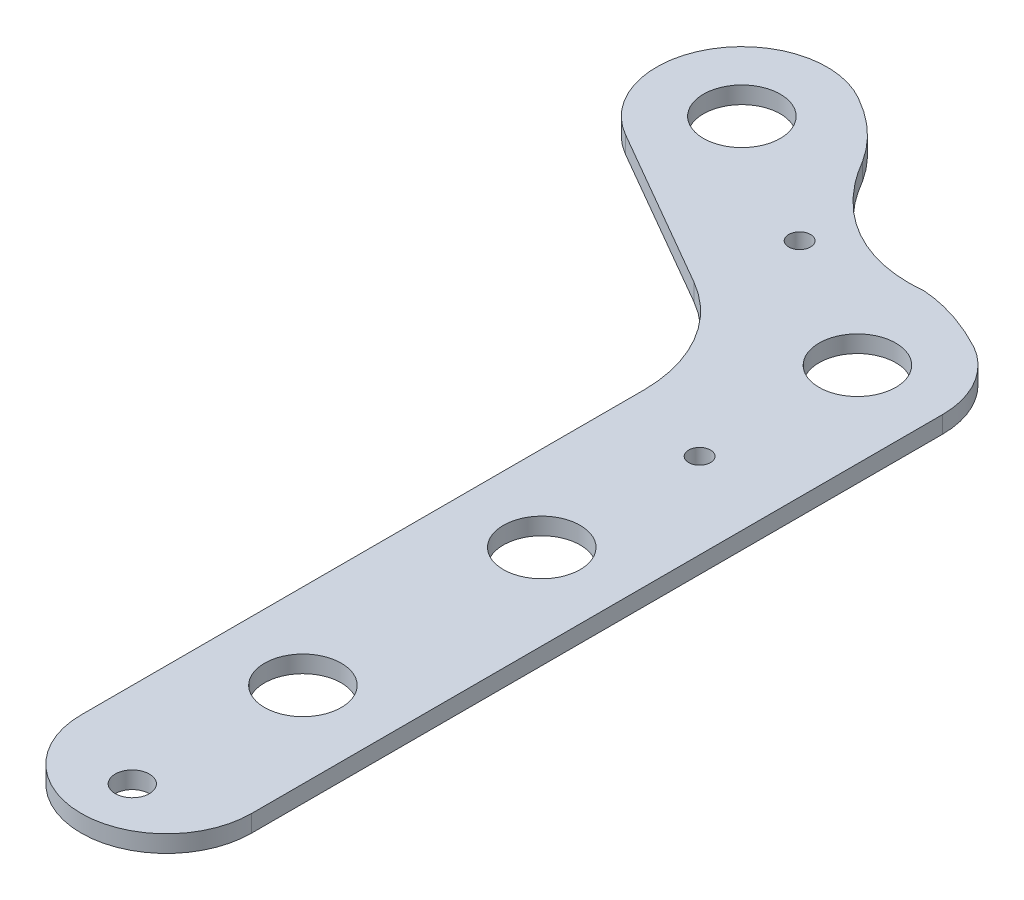
ISO-10303-21;
HEADER;
FILE_DESCRIPTION(('STEP AP214'),'2;1');
FILE_NAME('part.step','',(''),(''),'','','');
FILE_SCHEMA(('AUTOMOTIVE_DESIGN { 1 0 10303 214 1 1 1 1 }'));
ENDSEC;
DATA;
#1=APPLICATION_CONTEXT('core data for automotive mechanical design processes');
#2=APPLICATION_PROTOCOL_DEFINITION('international standard','automotive_design',2000,#1);
#3=PRODUCT_CONTEXT('',#1,'mechanical');
#4=PRODUCT('Part','Part','',(#3));
#5=PRODUCT_RELATED_PRODUCT_CATEGORY('part','',(#4));
#6=PRODUCT_DEFINITION_FORMATION('','',#4);
#7=PRODUCT_DEFINITION_CONTEXT('part definition',#1,'design');
#8=PRODUCT_DEFINITION('design','',#6,#7);
#9=PRODUCT_DEFINITION_SHAPE('','',#8);
#10=(LENGTH_UNIT() NAMED_UNIT(*) SI_UNIT(.MILLI.,.METRE.));
#11=(NAMED_UNIT(*) PLANE_ANGLE_UNIT() SI_UNIT($,.RADIAN.));
#12=(NAMED_UNIT(*) SI_UNIT($,.STERADIAN.) SOLID_ANGLE_UNIT());
#13=UNCERTAINTY_MEASURE_WITH_UNIT(LENGTH_MEASURE(1.E-05),#10,'distance_accuracy_value','');
#14=(GEOMETRIC_REPRESENTATION_CONTEXT(3) GLOBAL_UNCERTAINTY_ASSIGNED_CONTEXT((#13)) GLOBAL_UNIT_ASSIGNED_CONTEXT((#10,
#11,#12)) REPRESENTATION_CONTEXT('',''));
#15=CARTESIAN_POINT('',(0.,0.,0.));
#16=DIRECTION('',(0.,0.,1.));
#17=DIRECTION('',(1.,0.,0.));
#18=AXIS2_PLACEMENT_3D('',#15,#16,#17);
#19=CARTESIAN_POINT('',(-101.736334309577,6.35,-176.2125));
#20=DIRECTION('',(0.,-1.,0.));
#21=DIRECTION('',(0.,0.,-1.));
#22=AXIS2_PLACEMENT_3D('',#19,#20,#21);
#23=PLANE('',#22);
#24=CARTESIAN_POINT('',(-101.736334309577,6.35,-176.2125));
#25=DIRECTION('',(0.,1.,0.));
#26=DIRECTION('',(0.,0.,-1.));
#27=AXIS2_PLACEMENT_3D('',#24,#25,#26);
#28=CIRCLE('',#27,31.7499999999993);
#29=CARTESIAN_POINT('',(-85.8613343095773,6.35,-203.708806570155));
#30=VERTEX_POINT('',#29);
#31=CARTESIAN_POINT('',(-117.611334309577,6.35,-148.716193429845));
#32=VERTEX_POINT('',#31);
#33=EDGE_CURVE('E275',#30,#32,#28,.T.);
#34=ORIENTED_EDGE('',*,*,#33,.T.);
#35=DIRECTION('',(0.866025403784439,0.,0.5));
#36=VECTOR('',#35,1.);
#37=CARTESIAN_POINT('',(-57.1500000000007,6.35,-113.808825790647));
#38=LINE('',#37,#36);
#39=CARTESIAN_POINT('',(-57.1500000000007,6.35,-113.808825790647));
#40=VERTEX_POINT('',#39);
#41=EDGE_CURVE('E102',#32,#40,#38,.T.);
#42=ORIENTED_EDGE('',*,*,#41,.T.);
#43=CARTESIAN_POINT('',(-82.5500000000007,6.35,-69.8147352783976));
#44=DIRECTION('',(0.,-1.,0.));
#45=DIRECTION('',(0.,0.,1.));
#46=AXIS2_PLACEMENT_3D('',#43,#44,#45);
#47=CIRCLE('',#46,50.8);
#48=CARTESIAN_POINT('',(-31.7500000000007,6.35,-69.8147352783976));
#49=VERTEX_POINT('',#48);
#50=EDGE_CURVE('E278',#40,#49,#47,.T.);
#51=ORIENTED_EDGE('',*,*,#50,.T.);
#52=DIRECTION('',(0.,0.,1.));
#53=VECTOR('',#52,1.);
#54=CARTESIAN_POINT('',(-31.7500000000007,6.35,18.2729184521306));
#55=LINE('',#54,#53);
#56=CARTESIAN_POINT('',(-31.7500000000007,6.35,139.7));
#57=VERTEX_POINT('',#56);
#58=EDGE_CURVE('E280',#49,#57,#55,.T.);
#59=ORIENTED_EDGE('',*,*,#58,.T.);
#60=CARTESIAN_POINT('',(-7.01545972458869E-13,6.35,139.7));
#61=DIRECTION('',(0.,1.,0.));
#62=DIRECTION('',(0.,0.,-1.));
#63=AXIS2_PLACEMENT_3D('',#60,#61,#62);
#64=CIRCLE('',#63,31.75);
#65=CARTESIAN_POINT('',(31.7499999999993,6.35,139.7));
#66=VERTEX_POINT('',#65);
#67=EDGE_CURVE('E282',#57,#66,#64,.T.);
#68=ORIENTED_EDGE('',*,*,#67,.T.);
#69=DIRECTION('',(0.,0.,-1.));
#70=VECTOR('',#69,1.);
#71=CARTESIAN_POINT('',(31.7499999999993,6.35,78.3930280471627));
#72=LINE('',#71,#70);
#73=CARTESIAN_POINT('',(31.7499999999993,6.35,-117.475));
#74=VERTEX_POINT('',#73);
#75=EDGE_CURVE('E284',#66,#74,#72,.T.);
#76=ORIENTED_EDGE('',*,*,#75,.T.);
#77=CARTESIAN_POINT('',(0.,6.35,-117.475));
#78=DIRECTION('',(0.,1.,0.));
#79=DIRECTION('',(0.,0.,1.));
#80=AXIS2_PLACEMENT_3D('',#77,#78,#79);
#81=CIRCLE('',#80,31.7499999999993);
#82=CARTESIAN_POINT('',(15.8749999999996,6.35,-144.971306570155));
#83=VERTEX_POINT('',#82);
#84=EDGE_CURVE('E127',#74,#83,#81,.T.);
#85=ORIENTED_EDGE('',*,*,#84,.T.);
#86=CARTESIAN_POINT('',(15.8749999999997,6.35,-144.971306570155));
#87=CARTESIAN_POINT('',(1.22445048235463,6.35,-152.855976046516));
#88=CARTESIAN_POINT('',(-11.4263853245987,6.35,-153.835795689486));
#89=B_SPLINE_CURVE_WITH_KNOTS('',2,(#86,#87,#88),.UNSPECIFIED.,.F.,.F.,(3,3),(0.,1.),.UNSPECIFIED.);
#90=CARTESIAN_POINT('',(-11.4263853245987,6.35,-153.835795689486));
#91=VERTEX_POINT('',#90);
#92=EDGE_CURVE('E121',#83,#91,#89,.T.);
#93=ORIENTED_EDGE('',*,*,#92,.T.);
#94=CARTESIAN_POINT('',(-11.4263853245987,6.35,-153.835795689486));
#95=CARTESIAN_POINT('',(-33.1836717397411,6.35,-151.627706726659));
#96=CARTESIAN_POINT('',(-52.4235071210075,6.35,-162.771572898098));
#97=CARTESIAN_POINT('',(-64.7835066551173,6.35,-184.207168681212));
#98=B_SPLINE_CURVE_WITH_KNOTS('',3,(#94,#95,#96,#97),.UNSPECIFIED.,.F.,.F.,(4,4),(0.,1.),.UNSPECIFIED.);
#99=CARTESIAN_POINT('',(-64.7835066551173,6.35,-184.207168681212));
#100=VERTEX_POINT('',#99);
#101=EDGE_CURVE('E125',#91,#100,#98,.T.);
#102=ORIENTED_EDGE('',*,*,#101,.T.);
#103=CARTESIAN_POINT('',(-64.7835066551173,6.35,-184.207168681212));
#104=CARTESIAN_POINT('',(-72.3862869621943,6.35,-196.104383794497));
#105=CARTESIAN_POINT('',(-85.8613343095773,6.35,-203.708806570155));
#106=B_SPLINE_CURVE_WITH_KNOTS('',2,(#103,#104,#105),.UNSPECIFIED.,.F.,.F.,(3,3),(0.,1.),.UNSPECIFIED.);
#107=EDGE_CURVE('E53',#100,#30,#106,.T.);
#108=ORIENTED_EDGE('',*,*,#107,.T.);
#109=EDGE_LOOP('',(#34,#42,#51,#59,#68,#76,#85,#93,#102,#108));
#110=FACE_BOUND('',#109,.T.);
#111=CARTESIAN_POINT('',(0.,6.35,0.));
#112=DIRECTION('',(0.,1.,0.));
#113=DIRECTION('',(0.,0.,1.));
#114=AXIS2_PLACEMENT_3D('',#111,#112,#113);
#115=CIRCLE('',#114,14.2875);
#116=CARTESIAN_POINT('',(0.,6.35,14.2875));
#117=VERTEX_POINT('',#116);
#118=EDGE_CURVE('E269',#117,#117,#115,.T.);
#119=ORIENTED_EDGE('',*,*,#118,.F.);
#120=EDGE_LOOP('',(#119));
#121=FACE_BOUND('',#120,.T.);
#122=CARTESIAN_POINT('',(0.,6.35,88.9));
#123=DIRECTION('',(0.,1.,0.));
#124=DIRECTION('',(0.,0.,1.));
#125=AXIS2_PLACEMENT_3D('',#122,#123,#124);
#126=CIRCLE('',#125,14.2875);
#127=CARTESIAN_POINT('',(0.,6.35,103.1875));
#128=VERTEX_POINT('',#127);
#129=EDGE_CURVE('E263',#128,#128,#126,.T.);
#130=ORIENTED_EDGE('',*,*,#129,.F.);
#131=EDGE_LOOP('',(#130));
#132=FACE_BOUND('',#131,.T.);
#133=CARTESIAN_POINT('',(0.,6.35,-117.475));
#134=DIRECTION('',(0.,1.,0.));
#135=DIRECTION('',(0.,0.,1.));
#136=AXIS2_PLACEMENT_3D('',#133,#134,#135);
#137=CIRCLE('',#136,14.2875);
#138=CARTESIAN_POINT('',(0.,6.35,-103.1875));
#139=VERTEX_POINT('',#138);
#140=EDGE_CURVE('E257',#139,#139,#137,.T.);
#141=ORIENTED_EDGE('',*,*,#140,.F.);
#142=EDGE_LOOP('',(#141));
#143=FACE_BOUND('',#142,.T.);
#144=CARTESIAN_POINT('',(-101.736334309577,6.35,-176.2125));
#145=DIRECTION('',(0.,1.,0.));
#146=DIRECTION('',(0.,0.,1.));
#147=AXIS2_PLACEMENT_3D('',#144,#145,#146);
#148=CIRCLE('',#147,14.2874999999995);
#149=CARTESIAN_POINT('',(-101.736334309577,6.35,-161.925));
#150=VERTEX_POINT('',#149);
#151=EDGE_CURVE('E251',#150,#150,#148,.T.);
#152=ORIENTED_EDGE('',*,*,#151,.F.);
#153=EDGE_LOOP('',(#152));
#154=FACE_BOUND('',#153,.T.);
#155=CARTESIAN_POINT('',(-50.8681671547885,6.35,-146.84375));
#156=DIRECTION('',(0.,1.,0.));
#157=DIRECTION('',(0.,0.,1.));
#158=AXIS2_PLACEMENT_3D('',#155,#156,#157);
#159=CIRCLE('',#158,4.064);
#160=CARTESIAN_POINT('',(-50.8681671547885,6.35,-142.77975));
#161=VERTEX_POINT('',#160);
#162=EDGE_CURVE('E245',#161,#161,#159,.T.);
#163=ORIENTED_EDGE('',*,*,#162,.F.);
#164=EDGE_LOOP('',(#163));
#165=FACE_BOUND('',#164,.T.);
#166=CARTESIAN_POINT('',(-6.49552656743836E-13,6.35,152.4));
#167=DIRECTION('',(0.,1.,0.));
#168=DIRECTION('',(0.,0.,1.));
#169=AXIS2_PLACEMENT_3D('',#166,#167,#168);
#170=CIRCLE('',#169,6.35);
#171=CARTESIAN_POINT('',(-6.49552656743836E-13,6.35,158.75));
#172=VERTEX_POINT('',#171);
#173=EDGE_CURVE('E239',#172,#172,#170,.T.);
#174=ORIENTED_EDGE('',*,*,#173,.F.);
#175=EDGE_LOOP('',(#174));
#176=FACE_BOUND('',#175,.T.);
#177=CARTESIAN_POINT('',(0.,6.35,-58.7375));
#178=DIRECTION('',(0.,1.,0.));
#179=DIRECTION('',(0.,0.,1.));
#180=AXIS2_PLACEMENT_3D('',#177,#178,#179);
#181=CIRCLE('',#180,4.064);
#182=CARTESIAN_POINT('',(0.,6.35,-54.6735));
#183=VERTEX_POINT('',#182);
#184=EDGE_CURVE('E230',#183,#183,#181,.T.);
#185=ORIENTED_EDGE('',*,*,#184,.F.);
#186=EDGE_LOOP('',(#185));
#187=FACE_BOUND('',#186,.T.);
#188=ADVANCED_FACE('F36',(#110,#121,#132,#143,#154,#165,#176,#187),#23,.F.);
#189=CARTESIAN_POINT('',(-101.736334309577,0.,-176.2125));
#190=DIRECTION('',(0.,-1.,0.));
#191=DIRECTION('',(0.,0.,-1.));
#192=AXIS2_PLACEMENT_3D('',#189,#190,#191);
#193=PLANE('',#192);
#194=CARTESIAN_POINT('',(-6.49552656743836E-13,0.,152.4));
#195=DIRECTION('',(0.,1.,0.));
#196=DIRECTION('',(0.,0.,1.));
#197=AXIS2_PLACEMENT_3D('',#194,#195,#196);
#198=CIRCLE('',#197,6.35);
#199=CARTESIAN_POINT('',(-6.49552656743836E-13,0.,158.75));
#200=VERTEX_POINT('',#199);
#201=EDGE_CURVE('E236',#200,#200,#198,.T.);
#202=ORIENTED_EDGE('',*,*,#201,.T.);
#203=EDGE_LOOP('',(#202));
#204=FACE_BOUND('',#203,.T.);
#205=CARTESIAN_POINT('',(-101.736334309577,0.,-176.2125));
#206=DIRECTION('',(0.,1.,0.));
#207=DIRECTION('',(0.,0.,1.));
#208=AXIS2_PLACEMENT_3D('',#205,#206,#207);
#209=CIRCLE('',#208,14.2874999999995);
#210=CARTESIAN_POINT('',(-101.736334309577,0.,-161.925));
#211=VERTEX_POINT('',#210);
#212=EDGE_CURVE('E248',#211,#211,#209,.T.);
#213=ORIENTED_EDGE('',*,*,#212,.T.);
#214=EDGE_LOOP('',(#213));
#215=FACE_BOUND('',#214,.T.);
#216=CARTESIAN_POINT('',(0.,0.,88.9));
#217=DIRECTION('',(0.,1.,0.));
#218=DIRECTION('',(0.,0.,1.));
#219=AXIS2_PLACEMENT_3D('',#216,#217,#218);
#220=CIRCLE('',#219,14.2875);
#221=CARTESIAN_POINT('',(0.,0.,103.1875));
#222=VERTEX_POINT('',#221);
#223=EDGE_CURVE('E260',#222,#222,#220,.T.);
#224=ORIENTED_EDGE('',*,*,#223,.T.);
#225=EDGE_LOOP('',(#224));
#226=FACE_BOUND('',#225,.T.);
#227=CARTESIAN_POINT('',(-101.736334309577,0.,-176.2125));
#228=DIRECTION('',(0.,1.,0.));
#229=DIRECTION('',(0.,0.,-1.));
#230=AXIS2_PLACEMENT_3D('',#227,#228,#229);
#231=CIRCLE('',#230,31.7499999999993);
#232=CARTESIAN_POINT('',(-85.8613343095773,0.,-203.708806570155));
#233=VERTEX_POINT('',#232);
#234=CARTESIAN_POINT('',(-117.611334309577,0.,-148.716193429845));
#235=VERTEX_POINT('',#234);
#236=EDGE_CURVE('E272',#233,#235,#231,.T.);
#237=ORIENTED_EDGE('',*,*,#236,.F.);
#238=CARTESIAN_POINT('',(-64.7835066551173,0.,-184.207168681212));
#239=CARTESIAN_POINT('',(-72.3862869621943,0.,-196.104383794497));
#240=CARTESIAN_POINT('',(-85.8613343095773,0.,-203.708806570155));
#241=B_SPLINE_CURVE_WITH_KNOTS('',2,(#238,#239,#240),.UNSPECIFIED.,.F.,.F.,(3,3),(0.,1.),.UNSPECIFIED.);
#242=CARTESIAN_POINT('',(-64.7835066551173,0.,-184.207168681212));
#243=VERTEX_POINT('',#242);
#244=EDGE_CURVE('E94',#243,#233,#241,.T.);
#245=ORIENTED_EDGE('',*,*,#244,.F.);
#246=CARTESIAN_POINT('',(-11.4263853245987,0.,-153.835795689486));
#247=CARTESIAN_POINT('',(-33.1836717397411,0.,-151.627706726659));
#248=CARTESIAN_POINT('',(-52.4235071210075,0.,-162.771572898098));
#249=CARTESIAN_POINT('',(-64.7835066551173,0.,-184.207168681212));
#250=B_SPLINE_CURVE_WITH_KNOTS('',3,(#246,#247,#248,#249),.UNSPECIFIED.,.F.,.F.,(4,4),(0.,1.),.UNSPECIFIED.);
#251=CARTESIAN_POINT('',(-11.4263853245987,0.,-153.835795689486));
#252=VERTEX_POINT('',#251);
#253=EDGE_CURVE('E88',#252,#243,#250,.T.);
#254=ORIENTED_EDGE('',*,*,#253,.F.);
#255=CARTESIAN_POINT('',(15.8749999999997,0.,-144.971306570155));
#256=CARTESIAN_POINT('',(1.22445048235463,0.,-152.855976046516));
#257=CARTESIAN_POINT('',(-11.4263853245987,0.,-153.835795689486));
#258=B_SPLINE_CURVE_WITH_KNOTS('',2,(#255,#256,#257),.UNSPECIFIED.,.F.,.F.,(3,3),(0.,1.),.UNSPECIFIED.);
#259=CARTESIAN_POINT('',(15.8749999999996,0.,-144.971306570155));
#260=VERTEX_POINT('',#259);
#261=EDGE_CURVE('E135',#260,#252,#258,.T.);
#262=ORIENTED_EDGE('',*,*,#261,.F.);
#263=CARTESIAN_POINT('',(0.,0.,-117.475));
#264=DIRECTION('',(0.,1.,0.));
#265=DIRECTION('',(0.,0.,1.));
#266=AXIS2_PLACEMENT_3D('',#263,#264,#265);
#267=CIRCLE('',#266,31.7499999999993);
#268=CARTESIAN_POINT('',(31.7499999999993,0.,-117.475));
#269=VERTEX_POINT('',#268);
#270=EDGE_CURVE('E296',#269,#260,#267,.T.);
#271=ORIENTED_EDGE('',*,*,#270,.F.);
#272=DIRECTION('',(0.,0.,-1.));
#273=VECTOR('',#272,1.);
#274=CARTESIAN_POINT('',(31.7499999999993,0.,78.3930280471627));
#275=LINE('',#274,#273);
#276=CARTESIAN_POINT('',(31.7499999999993,0.,139.7));
#277=VERTEX_POINT('',#276);
#278=EDGE_CURVE('E292',#277,#269,#275,.T.);
#279=ORIENTED_EDGE('',*,*,#278,.F.);
#280=CARTESIAN_POINT('',(-7.01545972458869E-13,0.,139.7));
#281=DIRECTION('',(0.,1.,0.));
#282=DIRECTION('',(0.,0.,-1.));
#283=AXIS2_PLACEMENT_3D('',#280,#281,#282);
#284=CIRCLE('',#283,31.75);
#285=CARTESIAN_POINT('',(-31.7500000000007,0.,139.7));
#286=VERTEX_POINT('',#285);
#287=EDGE_CURVE('E319',#286,#277,#284,.T.);
#288=ORIENTED_EDGE('',*,*,#287,.F.);
#289=DIRECTION('',(0.,0.,1.));
#290=VECTOR('',#289,1.);
#291=CARTESIAN_POINT('',(-31.7500000000007,0.,139.7));
#292=LINE('',#291,#290);
#293=CARTESIAN_POINT('',(-31.7500000000007,0.,-69.8147352783976));
#294=VERTEX_POINT('',#293);
#295=EDGE_CURVE('E317',#294,#286,#292,.T.);
#296=ORIENTED_EDGE('',*,*,#295,.F.);
#297=CARTESIAN_POINT('',(-82.5500000000007,0.,-69.8147352783976));
#298=DIRECTION('',(0.,-1.,0.));
#299=DIRECTION('',(0.,0.,1.));
#300=AXIS2_PLACEMENT_3D('',#297,#298,#299);
#301=CIRCLE('',#300,50.8);
#302=CARTESIAN_POINT('',(-57.1500000000007,0.,-113.808825790647));
#303=VERTEX_POINT('',#302);
#304=EDGE_CURVE('E311',#303,#294,#301,.T.);
#305=ORIENTED_EDGE('',*,*,#304,.F.);
#306=DIRECTION('',(0.866025403784439,0.,0.5));
#307=VECTOR('',#306,1.);
#308=CARTESIAN_POINT('',(-57.1500000000007,0.,-113.808825790647));
#309=LINE('',#308,#307);
#310=EDGE_CURVE('E315',#235,#303,#309,.T.);
#311=ORIENTED_EDGE('',*,*,#310,.F.);
#312=EDGE_LOOP('',(#237,#245,#254,#262,#271,#279,#288,#296,#305,#311));
#313=FACE_BOUND('',#312,.T.);
#314=CARTESIAN_POINT('',(0.,0.,0.));
#315=DIRECTION('',(0.,1.,0.));
#316=DIRECTION('',(0.,0.,1.));
#317=AXIS2_PLACEMENT_3D('',#314,#315,#316);
#318=CIRCLE('',#317,14.2875);
#319=CARTESIAN_POINT('',(0.,0.,14.2875));
#320=VERTEX_POINT('',#319);
#321=EDGE_CURVE('E266',#320,#320,#318,.T.);
#322=ORIENTED_EDGE('',*,*,#321,.T.);
#323=EDGE_LOOP('',(#322));
#324=FACE_BOUND('',#323,.T.);
#325=CARTESIAN_POINT('',(0.,0.,-117.475));
#326=DIRECTION('',(0.,1.,0.));
#327=DIRECTION('',(0.,0.,1.));
#328=AXIS2_PLACEMENT_3D('',#325,#326,#327);
#329=CIRCLE('',#328,14.2875);
#330=CARTESIAN_POINT('',(0.,0.,-103.1875));
#331=VERTEX_POINT('',#330);
#332=EDGE_CURVE('E254',#331,#331,#329,.T.);
#333=ORIENTED_EDGE('',*,*,#332,.T.);
#334=EDGE_LOOP('',(#333));
#335=FACE_BOUND('',#334,.T.);
#336=CARTESIAN_POINT('',(-50.8681671547885,0.,-146.84375));
#337=DIRECTION('',(0.,1.,0.));
#338=DIRECTION('',(0.,0.,1.));
#339=AXIS2_PLACEMENT_3D('',#336,#337,#338);
#340=CIRCLE('',#339,4.064);
#341=CARTESIAN_POINT('',(-50.8681671547885,0.,-142.77975));
#342=VERTEX_POINT('',#341);
#343=EDGE_CURVE('E242',#342,#342,#340,.T.);
#344=ORIENTED_EDGE('',*,*,#343,.T.);
#345=EDGE_LOOP('',(#344));
#346=FACE_BOUND('',#345,.T.);
#347=CARTESIAN_POINT('',(0.,0.,-58.7375));
#348=DIRECTION('',(0.,1.,0.));
#349=DIRECTION('',(0.,0.,1.));
#350=AXIS2_PLACEMENT_3D('',#347,#348,#349);
#351=CIRCLE('',#350,4.064);
#352=CARTESIAN_POINT('',(0.,0.,-54.6735));
#353=VERTEX_POINT('',#352);
#354=EDGE_CURVE('E233',#353,#353,#351,.T.);
#355=ORIENTED_EDGE('',*,*,#354,.T.);
#356=EDGE_LOOP('',(#355));
#357=FACE_BOUND('',#356,.T.);
#358=ADVANCED_FACE('F189',(#204,#215,#226,#313,#324,#335,#346,#357),#193,.T.);
#359=CARTESIAN_POINT('',(-101.736334309577,6.35,-176.2125));
#360=DIRECTION('',(0.,-1.,0.));
#361=DIRECTION('',(0.,0.,-1.));
#362=AXIS2_PLACEMENT_3D('',#359,#360,#361);
#363=CYLINDRICAL_SURFACE('',#362,31.7499999999993);
#364=ORIENTED_EDGE('',*,*,#236,.T.);
#365=DIRECTION('',(0.,-1.,0.));
#366=VECTOR('',#365,1.);
#367=CARTESIAN_POINT('',(-117.611334309577,6.35,-148.716193429845));
#368=LINE('',#367,#366);
#369=EDGE_CURVE('E11',#32,#235,#368,.T.);
#370=ORIENTED_EDGE('',*,*,#369,.F.);
#371=ORIENTED_EDGE('',*,*,#33,.F.);
#372=DIRECTION('',(0.,-1.,0.));
#373=VECTOR('',#372,1.);
#374=CARTESIAN_POINT('',(-85.8613343095773,6.35,-203.708806570155));
#375=LINE('',#374,#373);
#376=EDGE_CURVE('E141',#30,#233,#375,.T.);
#377=ORIENTED_EDGE('',*,*,#376,.T.);
#378=EDGE_LOOP('',(#364,#370,#371,#377));
#379=FACE_BOUND('',#378,.T.);
#380=ADVANCED_FACE('F38',(#379),#363,.T.);
#381=CARTESIAN_POINT('',(-57.1500000000007,6.35,-113.808825790647));
#382=DIRECTION('',(0.5,0.,-0.866025403784439));
#383=DIRECTION('',(-0.866025403784439,0.,-0.5));
#384=AXIS2_PLACEMENT_3D('',#381,#382,#383);
#385=PLANE('',#384);
#386=ORIENTED_EDGE('',*,*,#310,.T.);
#387=DIRECTION('',(0.,-1.,0.));
#388=VECTOR('',#387,1.);
#389=CARTESIAN_POINT('',(-57.1500000000007,6.35,-113.808825790647));
#390=LINE('',#389,#388);
#391=EDGE_CURVE('E45',#40,#303,#390,.T.);
#392=ORIENTED_EDGE('',*,*,#391,.F.);
#393=ORIENTED_EDGE('',*,*,#41,.F.);
#394=ORIENTED_EDGE('',*,*,#369,.T.);
#395=EDGE_LOOP('',(#386,#392,#393,#394));
#396=FACE_BOUND('',#395,.T.);
#397=ADVANCED_FACE('F183',(#396),#385,.F.);
#398=CARTESIAN_POINT('',(-82.5500000000007,6.35,-69.8147352783976));
#399=DIRECTION('',(0.,-1.,0.));
#400=DIRECTION('',(0.,0.,-1.));
#401=AXIS2_PLACEMENT_3D('',#398,#399,#400);
#402=CYLINDRICAL_SURFACE('',#401,50.8);
#403=ORIENTED_EDGE('',*,*,#304,.T.);
#404=DIRECTION('',(0.,-1.,0.));
#405=VECTOR('',#404,1.);
#406=CARTESIAN_POINT('',(-31.7500000000007,6.35,-69.8147352783976));
#407=LINE('',#406,#405);
#408=EDGE_CURVE('E304',#49,#294,#407,.T.);
#409=ORIENTED_EDGE('',*,*,#408,.F.);
#410=ORIENTED_EDGE('',*,*,#50,.F.);
#411=ORIENTED_EDGE('',*,*,#391,.T.);
#412=EDGE_LOOP('',(#403,#409,#410,#411));
#413=FACE_BOUND('',#412,.T.);
#414=ADVANCED_FACE('F180',(#413),#402,.F.);
#415=CARTESIAN_POINT('',(-31.7500000000007,6.35,139.7));
#416=DIRECTION('',(1.,0.,0.));
#417=DIRECTION('',(0.,0.,-1.));
#418=AXIS2_PLACEMENT_3D('',#415,#416,#417);
#419=PLANE('',#418);
#420=ORIENTED_EDGE('',*,*,#295,.T.);
#421=DIRECTION('',(0.,-1.,0.));
#422=VECTOR('',#421,1.);
#423=CARTESIAN_POINT('',(-31.7500000000007,6.35,139.7));
#424=LINE('',#423,#422);
#425=EDGE_CURVE('E301',#57,#286,#424,.T.);
#426=ORIENTED_EDGE('',*,*,#425,.F.);
#427=ORIENTED_EDGE('',*,*,#58,.F.);
#428=ORIENTED_EDGE('',*,*,#408,.T.);
#429=EDGE_LOOP('',(#420,#426,#427,#428));
#430=FACE_BOUND('',#429,.T.);
#431=ADVANCED_FACE('F176',(#430),#419,.F.);
#432=CARTESIAN_POINT('',(-7.01545972458869E-13,6.35,139.7));
#433=DIRECTION('',(0.,-1.,0.));
#434=DIRECTION('',(0.,0.,-1.));
#435=AXIS2_PLACEMENT_3D('',#432,#433,#434);
#436=CYLINDRICAL_SURFACE('',#435,31.75);
#437=ORIENTED_EDGE('',*,*,#287,.T.);
#438=DIRECTION('',(0.,-1.,0.));
#439=VECTOR('',#438,1.);
#440=CARTESIAN_POINT('',(31.7499999999993,6.35,139.7));
#441=LINE('',#440,#439);
#442=EDGE_CURVE('E294',#66,#277,#441,.T.);
#443=ORIENTED_EDGE('',*,*,#442,.F.);
#444=ORIENTED_EDGE('',*,*,#67,.F.);
#445=ORIENTED_EDGE('',*,*,#425,.T.);
#446=EDGE_LOOP('',(#437,#443,#444,#445));
#447=FACE_BOUND('',#446,.T.);
#448=ADVANCED_FACE('F172',(#447),#436,.T.);
#449=CARTESIAN_POINT('',(31.7499999999993,6.35,78.3930280471627));
#450=DIRECTION('',(-1.,0.,0.));
#451=DIRECTION('',(0.,0.,1.));
#452=AXIS2_PLACEMENT_3D('',#449,#450,#451);
#453=PLANE('',#452);
#454=ORIENTED_EDGE('',*,*,#278,.T.);
#455=DIRECTION('',(0.,-1.,0.));
#456=VECTOR('',#455,1.);
#457=CARTESIAN_POINT('',(31.7499999999993,6.35,-117.475));
#458=LINE('',#457,#456);
#459=EDGE_CURVE('E291',#74,#269,#458,.T.);
#460=ORIENTED_EDGE('',*,*,#459,.F.);
#461=ORIENTED_EDGE('',*,*,#75,.F.);
#462=ORIENTED_EDGE('',*,*,#442,.T.);
#463=EDGE_LOOP('',(#454,#460,#461,#462));
#464=FACE_BOUND('',#463,.T.);
#465=ADVANCED_FACE('F168',(#464),#453,.F.);
#466=CARTESIAN_POINT('',(0.,6.35,-117.475));
#467=DIRECTION('',(0.,-1.,0.));
#468=DIRECTION('',(0.,0.,-1.));
#469=AXIS2_PLACEMENT_3D('',#466,#467,#468);
#470=CYLINDRICAL_SURFACE('',#469,31.7499999999993);
#471=ORIENTED_EDGE('',*,*,#270,.T.);
#472=DIRECTION('',(0.,-1.,0.));
#473=VECTOR('',#472,1.);
#474=CARTESIAN_POINT('',(15.8749999999996,6.35,-144.971306570155));
#475=LINE('',#474,#473);
#476=EDGE_CURVE('E136',#83,#260,#475,.T.);
#477=ORIENTED_EDGE('',*,*,#476,.F.);
#478=ORIENTED_EDGE('',*,*,#84,.F.);
#479=ORIENTED_EDGE('',*,*,#459,.T.);
#480=EDGE_LOOP('',(#471,#477,#478,#479));
#481=FACE_BOUND('',#480,.T.);
#482=ADVANCED_FACE('F165',(#481),#470,.T.);
#483=DIRECTION('',(0.,-1.,0.));
#484=VECTOR('',#483,1.);
#485=SURFACE_OF_LINEAR_EXTRUSION('',#89,#484);
#486=ORIENTED_EDGE('',*,*,#261,.T.);
#487=DIRECTION('',(0.,-1.,0.));
#488=VECTOR('',#487,1.);
#489=CARTESIAN_POINT('',(-11.4263853245987,6.35,-153.835795689486));
#490=LINE('',#489,#488);
#491=EDGE_CURVE('E132',#91,#252,#490,.T.);
#492=ORIENTED_EDGE('',*,*,#491,.F.);
#493=ORIENTED_EDGE('',*,*,#92,.F.);
#494=ORIENTED_EDGE('',*,*,#476,.T.);
#495=EDGE_LOOP('',(#486,#492,#493,#494));
#496=FACE_BOUND('',#495,.T.);
#497=ADVANCED_FACE('F133',(#496),#485,.F.);
#498=DIRECTION('',(0.,-1.,0.));
#499=VECTOR('',#498,1.);
#500=SURFACE_OF_LINEAR_EXTRUSION('',#98,#499);
#501=ORIENTED_EDGE('',*,*,#253,.T.);
#502=DIRECTION('',(0.,-1.,0.));
#503=VECTOR('',#502,1.);
#504=CARTESIAN_POINT('',(-64.7835066551173,6.35,-184.207168681212));
#505=LINE('',#504,#503);
#506=EDGE_CURVE('E137',#100,#243,#505,.T.);
#507=ORIENTED_EDGE('',*,*,#506,.F.);
#508=ORIENTED_EDGE('',*,*,#101,.F.);
#509=ORIENTED_EDGE('',*,*,#491,.T.);
#510=EDGE_LOOP('',(#501,#507,#508,#509));
#511=FACE_BOUND('',#510,.T.);
#512=ADVANCED_FACE('F139',(#511),#500,.F.);
#513=DIRECTION('',(0.,-1.,0.));
#514=VECTOR('',#513,1.);
#515=SURFACE_OF_LINEAR_EXTRUSION('',#106,#514);
#516=ORIENTED_EDGE('',*,*,#244,.T.);
#517=ORIENTED_EDGE('',*,*,#376,.F.);
#518=ORIENTED_EDGE('',*,*,#107,.F.);
#519=ORIENTED_EDGE('',*,*,#506,.T.);
#520=EDGE_LOOP('',(#516,#517,#518,#519));
#521=FACE_BOUND('',#520,.T.);
#522=ADVANCED_FACE('F161',(#521),#515,.F.);
#523=CARTESIAN_POINT('',(0.,6.35,0.));
#524=DIRECTION('',(0.,-1.,0.));
#525=DIRECTION('',(0.,0.,-1.));
#526=AXIS2_PLACEMENT_3D('',#523,#524,#525);
#527=CYLINDRICAL_SURFACE('',#526,14.2875);
#528=ORIENTED_EDGE('',*,*,#118,.T.);
#529=EDGE_LOOP('',(#528));
#530=FACE_BOUND('',#529,.T.);
#531=ORIENTED_EDGE('',*,*,#321,.F.);
#532=EDGE_LOOP('',(#531));
#533=FACE_BOUND('',#532,.T.);
#534=ADVANCED_FACE('F198',(#530,#533),#527,.F.);
#535=CARTESIAN_POINT('',(0.,6.35,88.9));
#536=DIRECTION('',(0.,-1.,0.));
#537=DIRECTION('',(0.,0.,-1.));
#538=AXIS2_PLACEMENT_3D('',#535,#536,#537);
#539=CYLINDRICAL_SURFACE('',#538,14.2875);
#540=ORIENTED_EDGE('',*,*,#129,.T.);
#541=EDGE_LOOP('',(#540));
#542=FACE_BOUND('',#541,.T.);
#543=ORIENTED_EDGE('',*,*,#223,.F.);
#544=EDGE_LOOP('',(#543));
#545=FACE_BOUND('',#544,.T.);
#546=ADVANCED_FACE('F201',(#542,#545),#539,.F.);
#547=CARTESIAN_POINT('',(0.,6.35,-117.475));
#548=DIRECTION('',(0.,-1.,0.));
#549=DIRECTION('',(0.,0.,-1.));
#550=AXIS2_PLACEMENT_3D('',#547,#548,#549);
#551=CYLINDRICAL_SURFACE('',#550,14.2875);
#552=ORIENTED_EDGE('',*,*,#140,.T.);
#553=EDGE_LOOP('',(#552));
#554=FACE_BOUND('',#553,.T.);
#555=ORIENTED_EDGE('',*,*,#332,.F.);
#556=EDGE_LOOP('',(#555));
#557=FACE_BOUND('',#556,.T.);
#558=ADVANCED_FACE('F205',(#554,#557),#551,.F.);
#559=CARTESIAN_POINT('',(-101.736334309577,6.35,-176.2125));
#560=DIRECTION('',(0.,-1.,0.));
#561=DIRECTION('',(0.,0.,-1.));
#562=AXIS2_PLACEMENT_3D('',#559,#560,#561);
#563=CYLINDRICAL_SURFACE('',#562,14.2874999999995);
#564=ORIENTED_EDGE('',*,*,#151,.T.);
#565=EDGE_LOOP('',(#564));
#566=FACE_BOUND('',#565,.T.);
#567=ORIENTED_EDGE('',*,*,#212,.F.);
#568=EDGE_LOOP('',(#567));
#569=FACE_BOUND('',#568,.T.);
#570=ADVANCED_FACE('F209',(#566,#569),#563,.F.);
#571=CARTESIAN_POINT('',(-50.8681671547885,6.35,-146.84375));
#572=DIRECTION('',(0.,-1.,0.));
#573=DIRECTION('',(0.,0.,-1.));
#574=AXIS2_PLACEMENT_3D('',#571,#572,#573);
#575=CYLINDRICAL_SURFACE('',#574,4.064);
#576=ORIENTED_EDGE('',*,*,#162,.T.);
#577=EDGE_LOOP('',(#576));
#578=FACE_BOUND('',#577,.T.);
#579=ORIENTED_EDGE('',*,*,#343,.F.);
#580=EDGE_LOOP('',(#579));
#581=FACE_BOUND('',#580,.T.);
#582=ADVANCED_FACE('F213',(#578,#581),#575,.F.);
#583=CARTESIAN_POINT('',(-6.49552656743836E-13,6.35,152.4));
#584=DIRECTION('',(0.,-1.,0.));
#585=DIRECTION('',(0.,0.,-1.));
#586=AXIS2_PLACEMENT_3D('',#583,#584,#585);
#587=CYLINDRICAL_SURFACE('',#586,6.35);
#588=ORIENTED_EDGE('',*,*,#173,.T.);
#589=EDGE_LOOP('',(#588));
#590=FACE_BOUND('',#589,.T.);
#591=ORIENTED_EDGE('',*,*,#201,.F.);
#592=EDGE_LOOP('',(#591));
#593=FACE_BOUND('',#592,.T.);
#594=ADVANCED_FACE('F217',(#590,#593),#587,.F.);
#595=CARTESIAN_POINT('',(0.,6.35,-58.7375));
#596=DIRECTION('',(0.,-1.,0.));
#597=DIRECTION('',(0.,0.,-1.));
#598=AXIS2_PLACEMENT_3D('',#595,#596,#597);
#599=CYLINDRICAL_SURFACE('',#598,4.064);
#600=ORIENTED_EDGE('',*,*,#184,.T.);
#601=EDGE_LOOP('',(#600));
#602=FACE_BOUND('',#601,.T.);
#603=ORIENTED_EDGE('',*,*,#354,.F.);
#604=EDGE_LOOP('',(#603));
#605=FACE_BOUND('',#604,.T.);
#606=ADVANCED_FACE('F221',(#602,#605),#599,.F.);
#607=CLOSED_SHELL('',(#188,#358,#380,#397,#414,#431,#448,#465,#482,#497,#512,#522,#534,#546,
#558,#570,#582,#594,#606));
#608=MANIFOLD_SOLID_BREP('B2',#607);
#609=ADVANCED_BREP_SHAPE_REPRESENTATION('',(#18,#608),#14);
#610=SHAPE_DEFINITION_REPRESENTATION(#9,#609);
ENDSEC;
END-ISO-10303-21;
